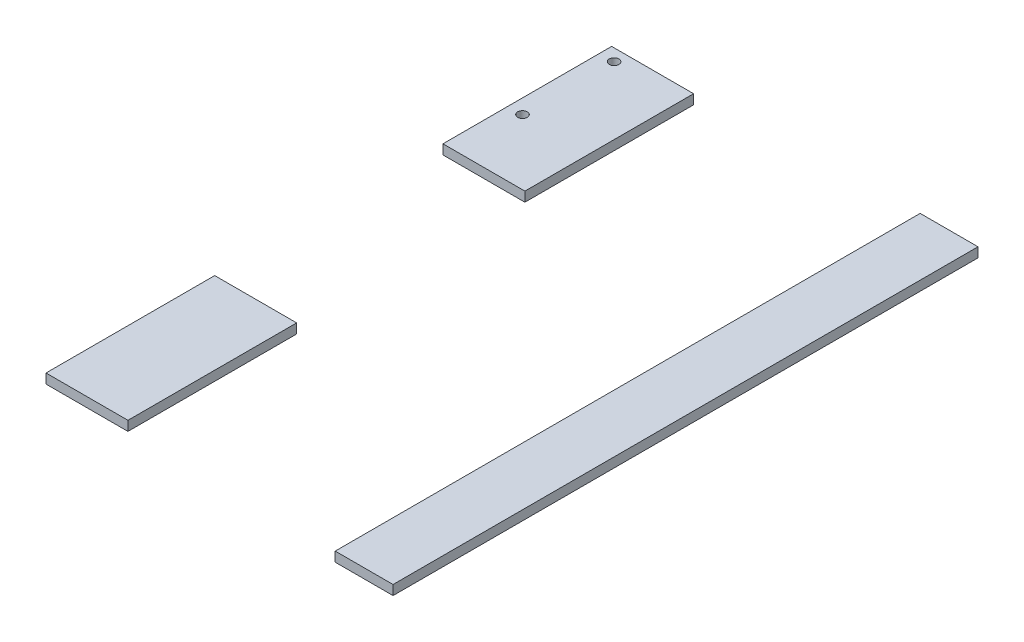
ISO-10303-21;
HEADER;
FILE_DESCRIPTION(('STEP AP214'),'2;1');
FILE_NAME('part.step','',(''),(''),'','','');
FILE_SCHEMA(('AUTOMOTIVE_DESIGN { 1 0 10303 214 1 1 1 1 }'));
ENDSEC;
DATA;
#1=APPLICATION_CONTEXT('core data for automotive mechanical design processes');
#2=APPLICATION_PROTOCOL_DEFINITION('international standard','automotive_design',2000,#1);
#3=PRODUCT_CONTEXT('',#1,'mechanical');
#4=PRODUCT('Part','Part','',(#3));
#5=PRODUCT_RELATED_PRODUCT_CATEGORY('part','',(#4));
#6=PRODUCT_DEFINITION_FORMATION('','',#4);
#7=PRODUCT_DEFINITION_CONTEXT('part definition',#1,'design');
#8=PRODUCT_DEFINITION('design','',#6,#7);
#9=PRODUCT_DEFINITION_SHAPE('','',#8);
#10=(LENGTH_UNIT() NAMED_UNIT(*) SI_UNIT(.MILLI.,.METRE.));
#11=(NAMED_UNIT(*) PLANE_ANGLE_UNIT() SI_UNIT($,.RADIAN.));
#12=(NAMED_UNIT(*) SI_UNIT($,.STERADIAN.) SOLID_ANGLE_UNIT());
#13=UNCERTAINTY_MEASURE_WITH_UNIT(LENGTH_MEASURE(1.E-05),#10,'distance_accuracy_value','');
#14=(GEOMETRIC_REPRESENTATION_CONTEXT(3) GLOBAL_UNCERTAINTY_ASSIGNED_CONTEXT((#13)) GLOBAL_UNIT_ASSIGNED_CONTEXT((#10,
#11,#12)) REPRESENTATION_CONTEXT('',''));
#15=CARTESIAN_POINT('',(0.,0.,0.));
#16=DIRECTION('',(0.,0.,1.));
#17=DIRECTION('',(1.,0.,0.));
#18=AXIS2_PLACEMENT_3D('',#15,#16,#17);
#19=CARTESIAN_POINT('',(31.,-0.825,0.));
#20=DIRECTION('',(0.,-1.,0.));
#21=DIRECTION('',(0.,0.,-1.));
#22=AXIS2_PLACEMENT_3D('',#19,#20,#21);
#23=PLANE('',#22);
#24=DIRECTION('',(-1.,0.,0.));
#25=VECTOR('',#24,1.);
#26=CARTESIAN_POINT('',(39.,-0.825,60.675));
#27=LINE('',#26,#25);
#28=CARTESIAN_POINT('',(37.,-0.825,60.675));
#29=VERTEX_POINT('',#28);
#30=CARTESIAN_POINT('',(25.,-0.825,60.675));
#31=VERTEX_POINT('',#30);
#32=EDGE_CURVE('P0_E26',#29,#31,#27,.T.);
#33=ORIENTED_EDGE('',*,*,#32,.F.);
#34=DIRECTION('',(0.,0.,1.));
#35=VECTOR('',#34,1.);
#36=CARTESIAN_POINT('',(37.,-0.825,-60.675));
#37=LINE('',#36,#35);
#38=CARTESIAN_POINT('',(37.,-0.825,-60.675));
#39=VERTEX_POINT('',#38);
#40=EDGE_CURVE('P0_E90',#39,#29,#37,.T.);
#41=ORIENTED_EDGE('',*,*,#40,.F.);
#42=DIRECTION('',(1.,0.,0.));
#43=VECTOR('',#42,1.);
#44=CARTESIAN_POINT('',(-39.,-0.825,-60.675));
#45=LINE('',#44,#43);
#46=CARTESIAN_POINT('',(25.,-0.825,-60.675));
#47=VERTEX_POINT('',#46);
#48=EDGE_CURVE('P0_E83',#47,#39,#45,.T.);
#49=ORIENTED_EDGE('',*,*,#48,.F.);
#50=DIRECTION('',(0.,0.,-1.));
#51=VECTOR('',#50,1.);
#52=CARTESIAN_POINT('',(25.,-0.825,60.675));
#53=LINE('',#52,#51);
#54=EDGE_CURVE('P0_E69',#31,#47,#53,.T.);
#55=ORIENTED_EDGE('',*,*,#54,.F.);
#56=EDGE_LOOP('',(#33,#41,#49,#55));
#57=FACE_BOUND('',#56,.T.);
#58=ADVANCED_FACE('P0_F17',(#57),#23,.F.);
#59=CARTESIAN_POINT('',(31.,-2.825,0.));
#60=DIRECTION('',(0.,-1.,0.));
#61=DIRECTION('',(0.,0.,-1.));
#62=AXIS2_PLACEMENT_3D('',#59,#60,#61);
#63=PLANE('',#62);
#64=DIRECTION('',(-1.,0.,0.));
#65=VECTOR('',#64,1.);
#66=CARTESIAN_POINT('',(39.,-2.825,60.675));
#67=LINE('',#66,#65);
#68=CARTESIAN_POINT('',(37.,-2.825,60.675));
#69=VERTEX_POINT('',#68);
#70=CARTESIAN_POINT('',(25.,-2.825,60.675));
#71=VERTEX_POINT('',#70);
#72=EDGE_CURVE('P0_E11',#69,#71,#67,.T.);
#73=ORIENTED_EDGE('',*,*,#72,.T.);
#74=DIRECTION('',(0.,0.,-1.));
#75=VECTOR('',#74,1.);
#76=CARTESIAN_POINT('',(25.,-2.825,60.675));
#77=LINE('',#76,#75);
#78=CARTESIAN_POINT('',(25.,-2.825,-60.675));
#79=VERTEX_POINT('',#78);
#80=EDGE_CURVE('P0_E20',#71,#79,#77,.T.);
#81=ORIENTED_EDGE('',*,*,#80,.T.);
#82=DIRECTION('',(1.,0.,0.));
#83=VECTOR('',#82,1.);
#84=CARTESIAN_POINT('',(-39.,-2.825,-60.675));
#85=LINE('',#84,#83);
#86=CARTESIAN_POINT('',(37.,-2.825,-60.675));
#87=VERTEX_POINT('',#86);
#88=EDGE_CURVE('P0_E85',#79,#87,#85,.T.);
#89=ORIENTED_EDGE('',*,*,#88,.T.);
#90=DIRECTION('',(0.,0.,1.));
#91=VECTOR('',#90,1.);
#92=CARTESIAN_POINT('',(37.,-2.825,-60.675));
#93=LINE('',#92,#91);
#94=EDGE_CURVE('P0_E100',#87,#69,#93,.T.);
#95=ORIENTED_EDGE('',*,*,#94,.T.);
#96=EDGE_LOOP('',(#73,#81,#89,#95));
#97=FACE_BOUND('',#96,.T.);
#98=ADVANCED_FACE('P0_F170',(#97),#63,.T.);
#99=CARTESIAN_POINT('',(37.,-0.825,60.675));
#100=DIRECTION('',(0.,0.,1.));
#101=DIRECTION('',(1.,0.,0.));
#102=AXIS2_PLACEMENT_3D('',#99,#100,#101);
#103=PLANE('',#102);
#104=ORIENTED_EDGE('',*,*,#32,.T.);
#105=DIRECTION('',(0.,-1.,0.));
#106=VECTOR('',#105,1.);
#107=CARTESIAN_POINT('',(25.,-0.825,60.675));
#108=LINE('',#107,#106);
#109=EDGE_CURVE('P0_E75',#31,#71,#108,.T.);
#110=ORIENTED_EDGE('',*,*,#109,.T.);
#111=ORIENTED_EDGE('',*,*,#72,.F.);
#112=DIRECTION('',(0.,-1.,0.));
#113=VECTOR('',#112,1.);
#114=CARTESIAN_POINT('',(37.,-0.825,60.675));
#115=LINE('',#114,#113);
#116=EDGE_CURVE('P0_E107',#29,#69,#115,.T.);
#117=ORIENTED_EDGE('',*,*,#116,.F.);
#118=EDGE_LOOP('',(#104,#110,#111,#117));
#119=FACE_BOUND('',#118,.T.);
#120=ADVANCED_FACE('P0_F175',(#119),#103,.T.);
#121=CARTESIAN_POINT('',(25.,-0.825,60.675));
#122=DIRECTION('',(-1.,0.,0.));
#123=DIRECTION('',(0.,0.,1.));
#124=AXIS2_PLACEMENT_3D('',#121,#122,#123);
#125=PLANE('',#124);
#126=ORIENTED_EDGE('',*,*,#54,.T.);
#127=DIRECTION('',(0.,-1.,0.));
#128=VECTOR('',#127,1.);
#129=CARTESIAN_POINT('',(25.,-0.825,-60.675));
#130=LINE('',#129,#128);
#131=EDGE_CURVE('P0_E73',#47,#79,#130,.T.);
#132=ORIENTED_EDGE('',*,*,#131,.T.);
#133=ORIENTED_EDGE('',*,*,#80,.F.);
#134=ORIENTED_EDGE('',*,*,#109,.F.);
#135=EDGE_LOOP('',(#126,#132,#133,#134));
#136=FACE_BOUND('',#135,.T.);
#137=ADVANCED_FACE('P0_F71',(#136),#125,.T.);
#138=CARTESIAN_POINT('',(25.,-0.825,-60.675));
#139=DIRECTION('',(0.,0.,-1.));
#140=DIRECTION('',(0.,-1.,0.));
#141=AXIS2_PLACEMENT_3D('',#138,#139,#140);
#142=PLANE('',#141);
#143=ORIENTED_EDGE('',*,*,#48,.T.);
#144=DIRECTION('',(0.,-1.,0.));
#145=VECTOR('',#144,1.);
#146=CARTESIAN_POINT('',(37.,-0.825,-60.675));
#147=LINE('',#146,#145);
#148=EDGE_CURVE('P0_E92',#39,#87,#147,.T.);
#149=ORIENTED_EDGE('',*,*,#148,.T.);
#150=ORIENTED_EDGE('',*,*,#88,.F.);
#151=ORIENTED_EDGE('',*,*,#131,.F.);
#152=EDGE_LOOP('',(#143,#149,#150,#151));
#153=FACE_BOUND('',#152,.T.);
#154=ADVANCED_FACE('P0_F81',(#153),#142,.T.);
#155=CARTESIAN_POINT('',(37.,-0.825,-60.675));
#156=DIRECTION('',(1.,0.,0.));
#157=DIRECTION('',(0.,0.,1.));
#158=AXIS2_PLACEMENT_3D('',#155,#156,#157);
#159=PLANE('',#158);
#160=ORIENTED_EDGE('',*,*,#40,.T.);
#161=ORIENTED_EDGE('',*,*,#116,.T.);
#162=ORIENTED_EDGE('',*,*,#94,.F.);
#163=ORIENTED_EDGE('',*,*,#148,.F.);
#164=EDGE_LOOP('',(#160,#161,#162,#163));
#165=FACE_BOUND('',#164,.T.);
#166=ADVANCED_FACE('P0_F154',(#165),#159,.T.);
#167=CLOSED_SHELL('',(#58,#98,#120,#137,#154,#166));
#168=MANIFOLD_SOLID_BREP('P0_B1',#167);
#169=CARTESIAN_POINT('',(-28.5,-0.825,41.175));
#170=DIRECTION('',(0.,-1.,0.));
#171=DIRECTION('',(0.,0.,-1.));
#172=AXIS2_PLACEMENT_3D('',#169,#170,#171);
#173=PLANE('',#172);
#174=DIRECTION('',(-1.,0.,0.));
#175=VECTOR('',#174,1.);
#176=CARTESIAN_POINT('',(-20.,-0.825,58.675));
#177=LINE('',#176,#175);
#178=CARTESIAN_POINT('',(-20.,-0.825,58.675));
#179=VERTEX_POINT('',#178);
#180=CARTESIAN_POINT('',(-37.,-0.825,58.675));
#181=VERTEX_POINT('',#180);
#182=EDGE_CURVE('P1_E20',#179,#181,#177,.T.);
#183=ORIENTED_EDGE('',*,*,#182,.F.);
#184=DIRECTION('',(0.,0.,1.));
#185=VECTOR('',#184,1.);
#186=CARTESIAN_POINT('',(-20.,-0.825,23.675));
#187=LINE('',#186,#185);
#188=CARTESIAN_POINT('',(-20.,-0.825,23.675));
#189=VERTEX_POINT('',#188);
#190=EDGE_CURVE('P1_E88',#189,#179,#187,.T.);
#191=ORIENTED_EDGE('',*,*,#190,.F.);
#192=DIRECTION('',(1.,0.,0.));
#193=VECTOR('',#192,1.);
#194=CARTESIAN_POINT('',(-37.,-0.825,23.675));
#195=LINE('',#194,#193);
#196=CARTESIAN_POINT('',(-37.,-0.825,23.675));
#197=VERTEX_POINT('',#196);
#198=EDGE_CURVE('P1_E70',#197,#189,#195,.T.);
#199=ORIENTED_EDGE('',*,*,#198,.F.);
#200=DIRECTION('',(0.,0.,-1.));
#201=VECTOR('',#200,1.);
#202=CARTESIAN_POINT('',(-37.,-0.825,58.675));
#203=LINE('',#202,#201);
#204=EDGE_CURVE('P1_E103',#181,#197,#203,.T.);
#205=ORIENTED_EDGE('',*,*,#204,.F.);
#206=EDGE_LOOP('',(#183,#191,#199,#205));
#207=FACE_BOUND('',#206,.T.);
#208=ADVANCED_FACE('P1_F17',(#207),#173,.F.);
#209=CARTESIAN_POINT('',(-28.5,-2.825,41.175));
#210=DIRECTION('',(0.,-1.,0.));
#211=DIRECTION('',(0.,0.,-1.));
#212=AXIS2_PLACEMENT_3D('',#209,#210,#211);
#213=PLANE('',#212);
#214=DIRECTION('',(-1.,0.,0.));
#215=VECTOR('',#214,1.);
#216=CARTESIAN_POINT('',(-20.,-2.825,58.675));
#217=LINE('',#216,#215);
#218=CARTESIAN_POINT('',(-20.,-2.825,58.675));
#219=VERTEX_POINT('',#218);
#220=CARTESIAN_POINT('',(-37.,-2.825,58.675));
#221=VERTEX_POINT('',#220);
#222=EDGE_CURVE('P1_E11',#219,#221,#217,.T.);
#223=ORIENTED_EDGE('',*,*,#222,.T.);
#224=DIRECTION('',(0.,0.,-1.));
#225=VECTOR('',#224,1.);
#226=CARTESIAN_POINT('',(-37.,-2.825,58.675));
#227=LINE('',#226,#225);
#228=CARTESIAN_POINT('',(-37.,-2.825,23.675));
#229=VERTEX_POINT('',#228);
#230=EDGE_CURVE('P1_E110',#221,#229,#227,.T.);
#231=ORIENTED_EDGE('',*,*,#230,.T.);
#232=DIRECTION('',(1.,0.,0.));
#233=VECTOR('',#232,1.);
#234=CARTESIAN_POINT('',(-37.,-2.825,23.675));
#235=LINE('',#234,#233);
#236=CARTESIAN_POINT('',(-20.,-2.825,23.675));
#237=VERTEX_POINT('',#236);
#238=EDGE_CURVE('P1_E82',#229,#237,#235,.T.);
#239=ORIENTED_EDGE('',*,*,#238,.T.);
#240=DIRECTION('',(0.,0.,1.));
#241=VECTOR('',#240,1.);
#242=CARTESIAN_POINT('',(-20.,-2.825,23.675));
#243=LINE('',#242,#241);
#244=EDGE_CURVE('P1_E89',#237,#219,#243,.T.);
#245=ORIENTED_EDGE('',*,*,#244,.T.);
#246=EDGE_LOOP('',(#223,#231,#239,#245));
#247=FACE_BOUND('',#246,.T.);
#248=ADVANCED_FACE('P1_F161',(#247),#213,.T.);
#249=CARTESIAN_POINT('',(-20.,-0.825,58.675));
#250=DIRECTION('',(0.,0.,1.));
#251=DIRECTION('',(1.,0.,0.));
#252=AXIS2_PLACEMENT_3D('',#249,#250,#251);
#253=PLANE('',#252);
#254=ORIENTED_EDGE('',*,*,#182,.T.);
#255=DIRECTION('',(0.,-1.,0.));
#256=VECTOR('',#255,1.);
#257=CARTESIAN_POINT('',(-37.,-0.825,58.675));
#258=LINE('',#257,#256);
#259=EDGE_CURVE('P1_E113',#181,#221,#258,.T.);
#260=ORIENTED_EDGE('',*,*,#259,.T.);
#261=ORIENTED_EDGE('',*,*,#222,.F.);
#262=DIRECTION('',(0.,-1.,0.));
#263=VECTOR('',#262,1.);
#264=CARTESIAN_POINT('',(-20.,-0.825,58.675));
#265=LINE('',#264,#263);
#266=EDGE_CURVE('P1_E93',#179,#219,#265,.T.);
#267=ORIENTED_EDGE('',*,*,#266,.F.);
#268=EDGE_LOOP('',(#254,#260,#261,#267));
#269=FACE_BOUND('',#268,.T.);
#270=ADVANCED_FACE('P1_F151',(#269),#253,.T.);
#271=CARTESIAN_POINT('',(-37.,-0.825,58.675));
#272=DIRECTION('',(-1.,0.,0.));
#273=DIRECTION('',(0.,0.,1.));
#274=AXIS2_PLACEMENT_3D('',#271,#272,#273);
#275=PLANE('',#274);
#276=ORIENTED_EDGE('',*,*,#204,.T.);
#277=DIRECTION('',(0.,-1.,0.));
#278=VECTOR('',#277,1.);
#279=CARTESIAN_POINT('',(-37.,-0.825,23.675));
#280=LINE('',#279,#278);
#281=EDGE_CURVE('P1_E77',#197,#229,#280,.T.);
#282=ORIENTED_EDGE('',*,*,#281,.T.);
#283=ORIENTED_EDGE('',*,*,#230,.F.);
#284=ORIENTED_EDGE('',*,*,#259,.F.);
#285=EDGE_LOOP('',(#276,#282,#283,#284));
#286=FACE_BOUND('',#285,.T.);
#287=ADVANCED_FACE('P1_F142',(#286),#275,.T.);
#288=CARTESIAN_POINT('',(-37.,-0.825,23.675));
#289=DIRECTION('',(0.,0.,-1.));
#290=DIRECTION('',(0.,-1.,0.));
#291=AXIS2_PLACEMENT_3D('',#288,#289,#290);
#292=PLANE('',#291);
#293=ORIENTED_EDGE('',*,*,#198,.T.);
#294=DIRECTION('',(0.,-1.,0.));
#295=VECTOR('',#294,1.);
#296=CARTESIAN_POINT('',(-20.,-0.825,23.675));
#297=LINE('',#296,#295);
#298=EDGE_CURVE('P1_E74',#189,#237,#297,.T.);
#299=ORIENTED_EDGE('',*,*,#298,.T.);
#300=ORIENTED_EDGE('',*,*,#238,.F.);
#301=ORIENTED_EDGE('',*,*,#281,.F.);
#302=EDGE_LOOP('',(#293,#299,#300,#301));
#303=FACE_BOUND('',#302,.T.);
#304=ADVANCED_FACE('P1_F72',(#303),#292,.T.);
#305=CARTESIAN_POINT('',(-20.,-0.825,23.675));
#306=DIRECTION('',(1.,0.,0.));
#307=DIRECTION('',(0.,0.,1.));
#308=AXIS2_PLACEMENT_3D('',#305,#306,#307);
#309=PLANE('',#308);
#310=ORIENTED_EDGE('',*,*,#190,.T.);
#311=ORIENTED_EDGE('',*,*,#266,.T.);
#312=ORIENTED_EDGE('',*,*,#244,.F.);
#313=ORIENTED_EDGE('',*,*,#298,.F.);
#314=EDGE_LOOP('',(#310,#311,#312,#313));
#315=FACE_BOUND('',#314,.T.);
#316=ADVANCED_FACE('P1_F86',(#315),#309,.T.);
#317=CLOSED_SHELL('',(#208,#248,#270,#287,#304,#316));
#318=MANIFOLD_SOLID_BREP('P1_B1',#317);
#319=CARTESIAN_POINT('',(-28.5,-0.825,-41.175));
#320=DIRECTION('',(0.,-1.,0.));
#321=DIRECTION('',(0.,0.,-1.));
#322=AXIS2_PLACEMENT_3D('',#319,#320,#321);
#323=PLANE('',#322);
#324=CARTESIAN_POINT('',(-34.,-0.825,-56.175));
#325=DIRECTION('',(0.,1.,0.));
#326=DIRECTION('',(1.,0.,0.));
#327=AXIS2_PLACEMENT_3D('',#324,#325,#326);
#328=CIRCLE('',#327,1.);
#329=CARTESIAN_POINT('',(-35.,-0.825,-56.175));
#330=VERTEX_POINT('',#329);
#331=EDGE_CURVE('P2_E128',#330,#330,#328,.T.);
#332=ORIENTED_EDGE('',*,*,#331,.F.);
#333=EDGE_LOOP('',(#332));
#334=FACE_BOUND('',#333,.T.);
#335=CARTESIAN_POINT('',(-34.,-0.825,-37.175));
#336=DIRECTION('',(0.,1.,0.));
#337=DIRECTION('',(1.,0.,0.));
#338=AXIS2_PLACEMENT_3D('',#335,#336,#337);
#339=CIRCLE('',#338,1.);
#340=CARTESIAN_POINT('',(-35.,-0.825,-37.175));
#341=VERTEX_POINT('',#340);
#342=EDGE_CURVE('P2_E136',#341,#341,#339,.T.);
#343=ORIENTED_EDGE('',*,*,#342,.F.);
#344=EDGE_LOOP('',(#343));
#345=FACE_BOUND('',#344,.T.);
#346=DIRECTION('',(0.,0.,-1.));
#347=VECTOR('',#346,1.);
#348=CARTESIAN_POINT('',(-37.,-0.825,-23.675));
#349=LINE('',#348,#347);
#350=CARTESIAN_POINT('',(-37.,-0.825,-23.675));
#351=VERTEX_POINT('',#350);
#352=CARTESIAN_POINT('',(-37.,-0.825,-58.675));
#353=VERTEX_POINT('',#352);
#354=EDGE_CURVE('P2_E27',#351,#353,#349,.T.);
#355=ORIENTED_EDGE('',*,*,#354,.F.);
#356=DIRECTION('',(-1.,0.,0.));
#357=VECTOR('',#356,1.);
#358=CARTESIAN_POINT('',(-20.,-0.825,-23.675));
#359=LINE('',#358,#357);
#360=CARTESIAN_POINT('',(-20.,-0.825,-23.675));
#361=VERTEX_POINT('',#360);
#362=EDGE_CURVE('P2_E104',#361,#351,#359,.T.);
#363=ORIENTED_EDGE('',*,*,#362,.F.);
#364=DIRECTION('',(0.,0.,1.));
#365=VECTOR('',#364,1.);
#366=CARTESIAN_POINT('',(-20.,-0.825,-58.675));
#367=LINE('',#366,#365);
#368=CARTESIAN_POINT('',(-20.,-0.825,-58.675));
#369=VERTEX_POINT('',#368);
#370=EDGE_CURVE('P2_E98',#369,#361,#367,.T.);
#371=ORIENTED_EDGE('',*,*,#370,.F.);
#372=DIRECTION('',(1.,0.,0.));
#373=VECTOR('',#372,1.);
#374=CARTESIAN_POINT('',(-37.,-0.825,-58.675));
#375=LINE('',#374,#373);
#376=EDGE_CURVE('P2_E85',#353,#369,#375,.T.);
#377=ORIENTED_EDGE('',*,*,#376,.F.);
#378=EDGE_LOOP('',(#355,#363,#371,#377));
#379=FACE_BOUND('',#378,.T.);
#380=ADVANCED_FACE('P2_F17',(#334,#345,#379),#323,.F.);
#381=CARTESIAN_POINT('',(-28.5,-2.825,-41.175));
#382=DIRECTION('',(0.,-1.,0.));
#383=DIRECTION('',(0.,0.,-1.));
#384=AXIS2_PLACEMENT_3D('',#381,#382,#383);
#385=PLANE('',#384);
#386=CARTESIAN_POINT('',(-34.,-2.825,-56.175));
#387=DIRECTION('',(0.,1.,0.));
#388=DIRECTION('',(1.,0.,0.));
#389=AXIS2_PLACEMENT_3D('',#386,#387,#388);
#390=CIRCLE('',#389,1.);
#391=CARTESIAN_POINT('',(-35.,-2.825,-56.175));
#392=VERTEX_POINT('',#391);
#393=EDGE_CURVE('P2_E118',#392,#392,#390,.T.);
#394=ORIENTED_EDGE('',*,*,#393,.T.);
#395=EDGE_LOOP('',(#394));
#396=FACE_BOUND('',#395,.T.);
#397=CARTESIAN_POINT('',(-34.,-2.825,-37.175));
#398=DIRECTION('',(0.,1.,0.));
#399=DIRECTION('',(1.,0.,0.));
#400=AXIS2_PLACEMENT_3D('',#397,#398,#399);
#401=CIRCLE('',#400,1.);
#402=CARTESIAN_POINT('',(-35.,-2.825,-37.175));
#403=VERTEX_POINT('',#402);
#404=EDGE_CURVE('P2_E130',#403,#403,#401,.T.);
#405=ORIENTED_EDGE('',*,*,#404,.T.);
#406=EDGE_LOOP('',(#405));
#407=FACE_BOUND('',#406,.T.);
#408=DIRECTION('',(0.,0.,-1.));
#409=VECTOR('',#408,1.);
#410=CARTESIAN_POINT('',(-37.,-2.825,-23.675));
#411=LINE('',#410,#409);
#412=CARTESIAN_POINT('',(-37.,-2.825,-23.675));
#413=VERTEX_POINT('',#412);
#414=CARTESIAN_POINT('',(-37.,-2.825,-58.675));
#415=VERTEX_POINT('',#414);
#416=EDGE_CURVE('P2_E11',#413,#415,#411,.T.);
#417=ORIENTED_EDGE('',*,*,#416,.T.);
#418=DIRECTION('',(1.,0.,0.));
#419=VECTOR('',#418,1.);
#420=CARTESIAN_POINT('',(-37.,-2.825,-58.675));
#421=LINE('',#420,#419);
#422=CARTESIAN_POINT('',(-20.,-2.825,-58.675));
#423=VERTEX_POINT('',#422);
#424=EDGE_CURVE('P2_E94',#415,#423,#421,.T.);
#425=ORIENTED_EDGE('',*,*,#424,.T.);
#426=DIRECTION('',(0.,0.,1.));
#427=VECTOR('',#426,1.);
#428=CARTESIAN_POINT('',(-20.,-2.825,-58.675));
#429=LINE('',#428,#427);
#430=CARTESIAN_POINT('',(-20.,-2.825,-23.675));
#431=VERTEX_POINT('',#430);
#432=EDGE_CURVE('P2_E76',#423,#431,#429,.T.);
#433=ORIENTED_EDGE('',*,*,#432,.T.);
#434=DIRECTION('',(-1.,0.,0.));
#435=VECTOR('',#434,1.);
#436=CARTESIAN_POINT('',(-20.,-2.825,-23.675));
#437=LINE('',#436,#435);
#438=EDGE_CURVE('P2_E114',#431,#413,#437,.T.);
#439=ORIENTED_EDGE('',*,*,#438,.T.);
#440=EDGE_LOOP('',(#417,#425,#433,#439));
#441=FACE_BOUND('',#440,.T.);
#442=ADVANCED_FACE('P2_F19',(#396,#407,#441),#385,.T.);
#443=CARTESIAN_POINT('',(-37.,-0.825,-23.675));
#444=DIRECTION('',(-1.,0.,0.));
#445=DIRECTION('',(0.,0.,1.));
#446=AXIS2_PLACEMENT_3D('',#443,#444,#445);
#447=PLANE('',#446);
#448=ORIENTED_EDGE('',*,*,#354,.T.);
#449=DIRECTION('',(0.,-1.,0.));
#450=VECTOR('',#449,1.);
#451=CARTESIAN_POINT('',(-37.,-0.825,-58.675));
#452=LINE('',#451,#450);
#453=EDGE_CURVE('P2_E90',#353,#415,#452,.T.);
#454=ORIENTED_EDGE('',*,*,#453,.T.);
#455=ORIENTED_EDGE('',*,*,#416,.F.);
#456=DIRECTION('',(0.,-1.,0.));
#457=VECTOR('',#456,1.);
#458=CARTESIAN_POINT('',(-37.,-0.825,-23.675));
#459=LINE('',#458,#457);
#460=EDGE_CURVE('P2_E142',#351,#413,#459,.T.);
#461=ORIENTED_EDGE('',*,*,#460,.F.);
#462=EDGE_LOOP('',(#448,#454,#455,#461));
#463=FACE_BOUND('',#462,.T.);
#464=ADVANCED_FACE('P2_F157',(#463),#447,.T.);
#465=CARTESIAN_POINT('',(-37.,-0.825,-58.675));
#466=DIRECTION('',(0.,0.,-1.));
#467=DIRECTION('',(0.,-1.,0.));
#468=AXIS2_PLACEMENT_3D('',#465,#466,#467);
#469=PLANE('',#468);
#470=ORIENTED_EDGE('',*,*,#376,.T.);
#471=DIRECTION('',(0.,-1.,0.));
#472=VECTOR('',#471,1.);
#473=CARTESIAN_POINT('',(-20.,-0.825,-58.675));
#474=LINE('',#473,#472);
#475=EDGE_CURVE('P2_E89',#369,#423,#474,.T.);
#476=ORIENTED_EDGE('',*,*,#475,.T.);
#477=ORIENTED_EDGE('',*,*,#424,.F.);
#478=ORIENTED_EDGE('',*,*,#453,.F.);
#479=EDGE_LOOP('',(#470,#476,#477,#478));
#480=FACE_BOUND('',#479,.T.);
#481=ADVANCED_FACE('P2_F87',(#480),#469,.T.);
#482=CARTESIAN_POINT('',(-20.,-0.825,-58.675));
#483=DIRECTION('',(1.,0.,0.));
#484=DIRECTION('',(0.,0.,-1.));
#485=AXIS2_PLACEMENT_3D('',#482,#483,#484);
#486=PLANE('',#485);
#487=ORIENTED_EDGE('',*,*,#370,.T.);
#488=DIRECTION('',(0.,-1.,0.));
#489=VECTOR('',#488,1.);
#490=CARTESIAN_POINT('',(-20.,-0.825,-23.675));
#491=LINE('',#490,#489);
#492=EDGE_CURVE('P2_E106',#361,#431,#491,.T.);
#493=ORIENTED_EDGE('',*,*,#492,.T.);
#494=ORIENTED_EDGE('',*,*,#432,.F.);
#495=ORIENTED_EDGE('',*,*,#475,.F.);
#496=EDGE_LOOP('',(#487,#493,#494,#495));
#497=FACE_BOUND('',#496,.T.);
#498=ADVANCED_FACE('P2_F97',(#497),#486,.T.);
#499=CARTESIAN_POINT('',(-20.,-0.825,-23.675));
#500=DIRECTION('',(0.,0.,1.));
#501=DIRECTION('',(1.,0.,0.));
#502=AXIS2_PLACEMENT_3D('',#499,#500,#501);
#503=PLANE('',#502);
#504=ORIENTED_EDGE('',*,*,#362,.T.);
#505=ORIENTED_EDGE('',*,*,#460,.T.);
#506=ORIENTED_EDGE('',*,*,#438,.F.);
#507=ORIENTED_EDGE('',*,*,#492,.F.);
#508=EDGE_LOOP('',(#504,#505,#506,#507));
#509=FACE_BOUND('',#508,.T.);
#510=ADVANCED_FACE('P2_F177',(#509),#503,.T.);
#511=CARTESIAN_POINT('',(-34.,-0.825,-37.175));
#512=DIRECTION('',(0.,-1.,0.));
#513=DIRECTION('',(1.,0.,0.));
#514=AXIS2_PLACEMENT_3D('',#511,#512,#513);
#515=CYLINDRICAL_SURFACE('',#514,1.);
#516=ORIENTED_EDGE('',*,*,#404,.F.);
#517=DIRECTION('',(0.,1.,0.));
#518=VECTOR('',#517,1.);
#519=CARTESIAN_POINT('',(-35.,-0.825,-37.175));
#520=LINE('',#519,#518);
#521=EDGE_CURVE('P2_E132',#403,#341,#520,.T.);
#522=ORIENTED_EDGE('',*,*,#521,.T.);
#523=ORIENTED_EDGE('',*,*,#342,.T.);
#524=ORIENTED_EDGE('',*,*,#521,.F.);
#525=EDGE_LOOP('',(#516,#522,#523,#524));
#526=FACE_BOUND('',#525,.T.);
#527=ADVANCED_FACE('P2_F172',(#526),#515,.F.);
#528=CARTESIAN_POINT('',(-34.,-0.825,-56.175));
#529=DIRECTION('',(0.,-1.,0.));
#530=DIRECTION('',(1.,0.,0.));
#531=AXIS2_PLACEMENT_3D('',#528,#529,#530);
#532=CYLINDRICAL_SURFACE('',#531,1.);
#533=ORIENTED_EDGE('',*,*,#393,.F.);
#534=DIRECTION('',(0.,1.,0.));
#535=VECTOR('',#534,1.);
#536=CARTESIAN_POINT('',(-35.,-0.825,-56.175));
#537=LINE('',#536,#535);
#538=EDGE_CURVE('P2_E122',#392,#330,#537,.T.);
#539=ORIENTED_EDGE('',*,*,#538,.T.);
#540=ORIENTED_EDGE('',*,*,#331,.T.);
#541=ORIENTED_EDGE('',*,*,#538,.F.);
#542=EDGE_LOOP('',(#533,#539,#540,#541));
#543=FACE_BOUND('',#542,.T.);
#544=ADVANCED_FACE('P2_F176',(#543),#532,.F.);
#545=CLOSED_SHELL('',(#380,#442,#464,#481,#498,#510,#527,#544));
#546=MANIFOLD_SOLID_BREP('P2_B1',#545);
#547=ADVANCED_BREP_SHAPE_REPRESENTATION('',(#18,#168,#318,#546),#14);
#548=SHAPE_DEFINITION_REPRESENTATION(#9,#547);
ENDSEC;
END-ISO-10303-21;
